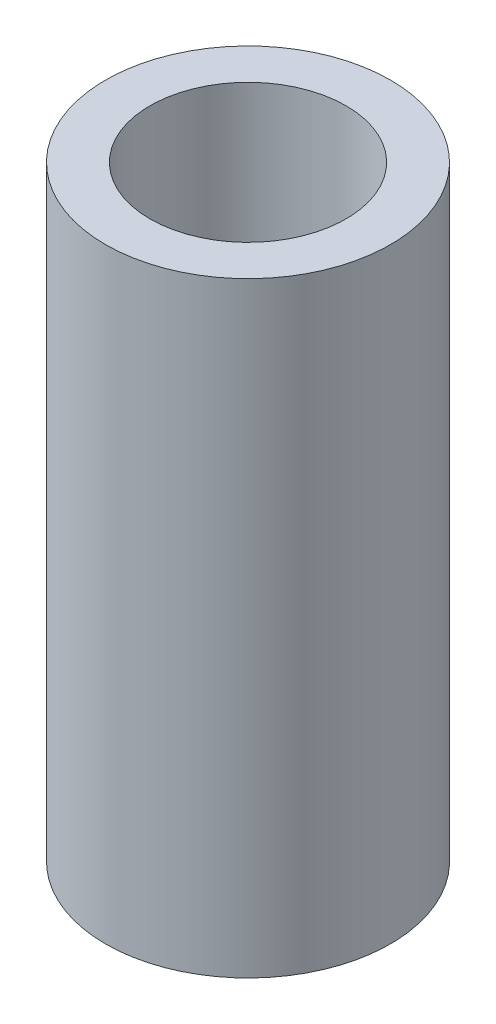
ISO-10303-21;
HEADER;
FILE_DESCRIPTION(('STEP AP214'),'2;1');
FILE_NAME('part.step','',(''),(''),'','','');
FILE_SCHEMA(('AUTOMOTIVE_DESIGN { 1 0 10303 214 1 1 1 1 }'));
ENDSEC;
DATA;
#1=APPLICATION_CONTEXT('core data for automotive mechanical design processes');
#2=APPLICATION_PROTOCOL_DEFINITION('international standard','automotive_design',2000,#1);
#3=PRODUCT_CONTEXT('',#1,'mechanical');
#4=PRODUCT('Part','Part','',(#3));
#5=PRODUCT_RELATED_PRODUCT_CATEGORY('part','',(#4));
#6=PRODUCT_DEFINITION_FORMATION('','',#4);
#7=PRODUCT_DEFINITION_CONTEXT('part definition',#1,'design');
#8=PRODUCT_DEFINITION('design','',#6,#7);
#9=PRODUCT_DEFINITION_SHAPE('','',#8);
#10=(LENGTH_UNIT() NAMED_UNIT(*) SI_UNIT(.MILLI.,.METRE.));
#11=(NAMED_UNIT(*) PLANE_ANGLE_UNIT() SI_UNIT($,.RADIAN.));
#12=(NAMED_UNIT(*) SI_UNIT($,.STERADIAN.) SOLID_ANGLE_UNIT());
#13=UNCERTAINTY_MEASURE_WITH_UNIT(LENGTH_MEASURE(1.E-05),#10,'distance_accuracy_value','');
#14=(GEOMETRIC_REPRESENTATION_CONTEXT(3) GLOBAL_UNCERTAINTY_ASSIGNED_CONTEXT((#13)) GLOBAL_UNIT_ASSIGNED_CONTEXT((#10,
#11,#12)) REPRESENTATION_CONTEXT('',''));
#15=CARTESIAN_POINT('',(0.,0.,0.));
#16=DIRECTION('',(0.,0.,1.));
#17=DIRECTION('',(1.,0.,0.));
#18=AXIS2_PLACEMENT_3D('',#15,#16,#17);
#19=CARTESIAN_POINT('',(0.,13.49375,0.));
#20=DIRECTION('',(0.,1.,0.));
#21=DIRECTION('',(0.,0.,1.));
#22=AXIS2_PLACEMENT_3D('',#19,#20,#21);
#23=PLANE('',#22);
#24=CARTESIAN_POINT('',(0.,13.49375,0.));
#25=DIRECTION('',(0.,1.,0.));
#26=DIRECTION('',(0.,0.,1.));
#27=AXIS2_PLACEMENT_3D('',#24,#25,#26);
#28=CIRCLE('',#27,3.175);
#29=CARTESIAN_POINT('',(0.,13.49375,3.175));
#30=VERTEX_POINT('',#29);
#31=EDGE_CURVE('E10',#30,#30,#28,.T.);
#32=ORIENTED_EDGE('',*,*,#31,.T.);
#33=EDGE_LOOP('',(#32));
#34=FACE_BOUND('',#33,.T.);
#35=CARTESIAN_POINT('',(0.,13.49375,0.));
#36=DIRECTION('',(0.,1.,0.));
#37=DIRECTION('',(0.,0.,1.));
#38=AXIS2_PLACEMENT_3D('',#35,#36,#37);
#39=CIRCLE('',#38,2.1844);
#40=CARTESIAN_POINT('',(0.,13.49375,2.1844));
#41=VERTEX_POINT('',#40);
#42=EDGE_CURVE('E27',#41,#41,#39,.T.);
#43=ORIENTED_EDGE('',*,*,#42,.F.);
#44=EDGE_LOOP('',(#43));
#45=FACE_BOUND('',#44,.T.);
#46=ADVANCED_FACE('F15',(#34,#45),#23,.T.);
#47=CARTESIAN_POINT('',(0.,0.,0.));
#48=DIRECTION('',(0.,1.,0.));
#49=DIRECTION('',(0.,0.,1.));
#50=AXIS2_PLACEMENT_3D('',#47,#48,#49);
#51=PLANE('',#50);
#52=CARTESIAN_POINT('',(0.,0.,0.));
#53=DIRECTION('',(0.,1.,0.));
#54=DIRECTION('',(0.,0.,1.));
#55=AXIS2_PLACEMENT_3D('',#52,#53,#54);
#56=CIRCLE('',#55,3.175);
#57=CARTESIAN_POINT('',(0.,0.,3.175));
#58=VERTEX_POINT('',#57);
#59=EDGE_CURVE('E19',#58,#58,#56,.T.);
#60=ORIENTED_EDGE('',*,*,#59,.F.);
#61=EDGE_LOOP('',(#60));
#62=FACE_BOUND('',#61,.T.);
#63=CARTESIAN_POINT('',(0.,0.,0.));
#64=DIRECTION('',(0.,1.,0.));
#65=DIRECTION('',(0.,0.,1.));
#66=AXIS2_PLACEMENT_3D('',#63,#64,#65);
#67=CIRCLE('',#66,2.1844);
#68=CARTESIAN_POINT('',(0.,0.,2.1844));
#69=VERTEX_POINT('',#68);
#70=EDGE_CURVE('E29',#69,#69,#67,.T.);
#71=ORIENTED_EDGE('',*,*,#70,.T.);
#72=EDGE_LOOP('',(#71));
#73=FACE_BOUND('',#72,.T.);
#74=ADVANCED_FACE('F40',(#62,#73),#51,.F.);
#75=CARTESIAN_POINT('',(0.,13.49375,0.));
#76=DIRECTION('',(0.,-1.,0.));
#77=DIRECTION('',(0.,0.,-1.));
#78=AXIS2_PLACEMENT_3D('',#75,#76,#77);
#79=CYLINDRICAL_SURFACE('',#78,3.175);
#80=ORIENTED_EDGE('',*,*,#31,.F.);
#81=EDGE_LOOP('',(#80));
#82=FACE_BOUND('',#81,.T.);
#83=ORIENTED_EDGE('',*,*,#59,.T.);
#84=EDGE_LOOP('',(#83));
#85=FACE_BOUND('',#84,.T.);
#86=ADVANCED_FACE('F17',(#82,#85),#79,.T.);
#87=CARTESIAN_POINT('',(0.,13.49375,0.));
#88=DIRECTION('',(0.,-1.,0.));
#89=DIRECTION('',(0.,0.,-1.));
#90=AXIS2_PLACEMENT_3D('',#87,#88,#89);
#91=CYLINDRICAL_SURFACE('',#90,2.1844);
#92=ORIENTED_EDGE('',*,*,#42,.T.);
#93=EDGE_LOOP('',(#92));
#94=FACE_BOUND('',#93,.T.);
#95=ORIENTED_EDGE('',*,*,#70,.F.);
#96=EDGE_LOOP('',(#95));
#97=FACE_BOUND('',#96,.T.);
#98=ADVANCED_FACE('F36',(#94,#97),#91,.F.);
#99=CLOSED_SHELL('',(#46,#74,#86,#98));
#100=MANIFOLD_SOLID_BREP('B1',#99);
#101=ADVANCED_BREP_SHAPE_REPRESENTATION('',(#18,#100),#14);
#102=SHAPE_DEFINITION_REPRESENTATION(#9,#101);
ENDSEC;
END-ISO-10303-21;
